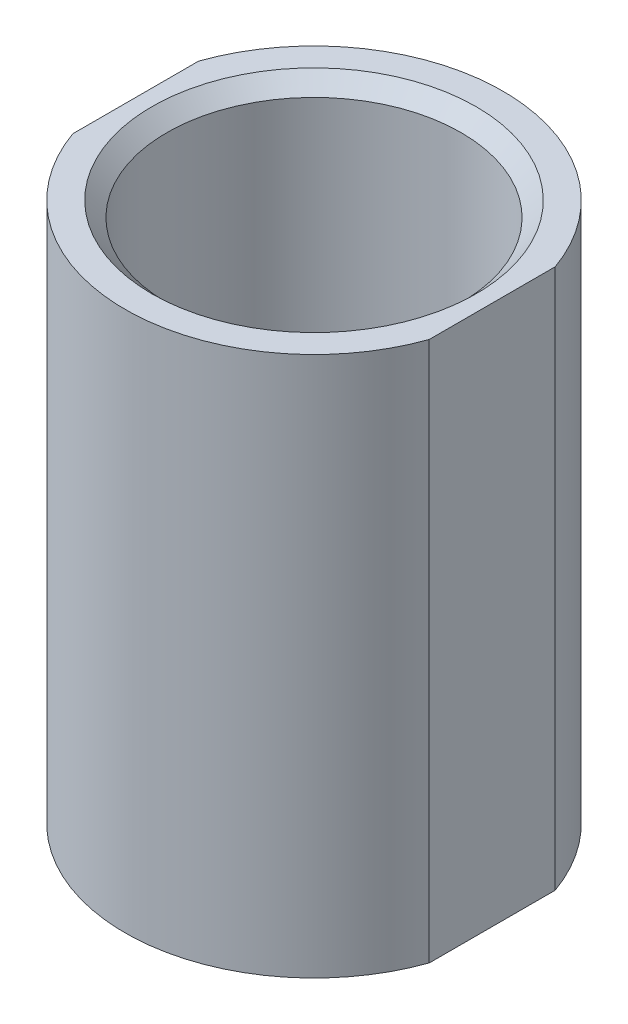
ISO-10303-21;
HEADER;
FILE_DESCRIPTION(('STEP AP214'),'2;1');
FILE_NAME('part.step','',(''),(''),'','','');
FILE_SCHEMA(('AUTOMOTIVE_DESIGN { 1 0 10303 214 1 1 1 1 }'));
ENDSEC;
DATA;
#1=APPLICATION_CONTEXT('core data for automotive mechanical design processes');
#2=APPLICATION_PROTOCOL_DEFINITION('international standard','automotive_design',2000,#1);
#3=PRODUCT_CONTEXT('',#1,'mechanical');
#4=PRODUCT('Part','Part','',(#3));
#5=PRODUCT_RELATED_PRODUCT_CATEGORY('part','',(#4));
#6=PRODUCT_DEFINITION_FORMATION('','',#4);
#7=PRODUCT_DEFINITION_CONTEXT('part definition',#1,'design');
#8=PRODUCT_DEFINITION('design','',#6,#7);
#9=PRODUCT_DEFINITION_SHAPE('','',#8);
#10=(LENGTH_UNIT() NAMED_UNIT(*) SI_UNIT(.MILLI.,.METRE.));
#11=(NAMED_UNIT(*) PLANE_ANGLE_UNIT() SI_UNIT($,.RADIAN.));
#12=(NAMED_UNIT(*) SI_UNIT($,.STERADIAN.) SOLID_ANGLE_UNIT());
#13=UNCERTAINTY_MEASURE_WITH_UNIT(LENGTH_MEASURE(1.E-05),#10,'distance_accuracy_value','');
#14=(GEOMETRIC_REPRESENTATION_CONTEXT(3) GLOBAL_UNCERTAINTY_ASSIGNED_CONTEXT((#13)) GLOBAL_UNIT_ASSIGNED_CONTEXT((#10,
#11,#12)) REPRESENTATION_CONTEXT('',''));
#15=CARTESIAN_POINT('',(0.,0.,0.));
#16=DIRECTION('',(0.,0.,1.));
#17=DIRECTION('',(1.,0.,0.));
#18=AXIS2_PLACEMENT_3D('',#15,#16,#17);
#19=CARTESIAN_POINT('',(33.,100.,0.));
#20=DIRECTION('',(1.,0.,0.));
#21=DIRECTION('',(0.,0.,-1.));
#22=AXIS2_PLACEMENT_3D('',#19,#20,#21);
#23=PLANE('',#22);
#24=DIRECTION('',(0.,0.,1.));
#25=VECTOR('',#24,1.);
#26=CARTESIAN_POINT('',(33.,0.,0.));
#27=LINE('',#26,#25);
#28=CARTESIAN_POINT('',(33.,0.,-11.6619037896906));
#29=VERTEX_POINT('',#28);
#30=CARTESIAN_POINT('',(33.,0.,11.6619037896906));
#31=VERTEX_POINT('',#30);
#32=EDGE_CURVE('E101',#29,#31,#27,.T.);
#33=ORIENTED_EDGE('',*,*,#32,.F.);
#34=DIRECTION('',(0.,-1.,0.));
#35=VECTOR('',#34,1.);
#36=CARTESIAN_POINT('',(33.,100.,-11.6619037896906));
#37=LINE('',#36,#35);
#38=CARTESIAN_POINT('',(33.,100.,-11.6619037896906));
#39=VERTEX_POINT('',#38);
#40=EDGE_CURVE('E11',#39,#29,#37,.T.);
#41=ORIENTED_EDGE('',*,*,#40,.F.);
#42=DIRECTION('',(0.,0.,1.));
#43=VECTOR('',#42,1.);
#44=CARTESIAN_POINT('',(33.,100.,0.));
#45=LINE('',#44,#43);
#46=CARTESIAN_POINT('',(33.,100.,11.6619037896906));
#47=VERTEX_POINT('',#46);
#48=EDGE_CURVE('E90',#39,#47,#45,.T.);
#49=ORIENTED_EDGE('',*,*,#48,.T.);
#50=DIRECTION('',(0.,-1.,0.));
#51=VECTOR('',#50,1.);
#52=CARTESIAN_POINT('',(33.,100.,11.6619037896906));
#53=LINE('',#52,#51);
#54=EDGE_CURVE('E79',#47,#31,#53,.T.);
#55=ORIENTED_EDGE('',*,*,#54,.T.);
#56=EDGE_LOOP('',(#33,#41,#49,#55));
#57=FACE_BOUND('',#56,.T.);
#58=ADVANCED_FACE('F40',(#57),#23,.T.);
#59=CARTESIAN_POINT('',(0.,100.,0.));
#60=DIRECTION('',(0.,-1.,0.));
#61=DIRECTION('',(0.,0.,-1.));
#62=AXIS2_PLACEMENT_3D('',#59,#60,#61);
#63=CYLINDRICAL_SURFACE('',#62,35.);
#64=CARTESIAN_POINT('',(0.,0.,0.));
#65=DIRECTION('',(0.,1.,0.));
#66=DIRECTION('',(0.,0.,1.));
#67=AXIS2_PLACEMENT_3D('',#64,#65,#66);
#68=CIRCLE('',#67,35.);
#69=CARTESIAN_POINT('',(-33.,0.,-11.6619037896906));
#70=VERTEX_POINT('',#69);
#71=EDGE_CURVE('E95',#29,#70,#68,.T.);
#72=ORIENTED_EDGE('',*,*,#71,.T.);
#73=DIRECTION('',(0.,-1.,0.));
#74=VECTOR('',#73,1.);
#75=CARTESIAN_POINT('',(-33.,100.,-11.6619037896906));
#76=LINE('',#75,#74);
#77=CARTESIAN_POINT('',(-33.,100.,-11.6619037896906));
#78=VERTEX_POINT('',#77);
#79=EDGE_CURVE('E48',#78,#70,#76,.T.);
#80=ORIENTED_EDGE('',*,*,#79,.F.);
#81=CARTESIAN_POINT('',(0.,100.,0.));
#82=DIRECTION('',(0.,1.,0.));
#83=DIRECTION('',(0.,0.,1.));
#84=AXIS2_PLACEMENT_3D('',#81,#82,#83);
#85=CIRCLE('',#84,35.);
#86=EDGE_CURVE('E85',#39,#78,#85,.T.);
#87=ORIENTED_EDGE('',*,*,#86,.F.);
#88=ORIENTED_EDGE('',*,*,#40,.T.);
#89=EDGE_LOOP('',(#72,#80,#87,#88));
#90=FACE_BOUND('',#89,.T.);
#91=ADVANCED_FACE('F93',(#90),#63,.T.);
#92=CARTESIAN_POINT('',(-33.,100.,0.));
#93=DIRECTION('',(1.,0.,0.));
#94=DIRECTION('',(0.,0.,-1.));
#95=AXIS2_PLACEMENT_3D('',#92,#93,#94);
#96=PLANE('',#95);
#97=DIRECTION('',(0.,0.,1.));
#98=VECTOR('',#97,1.);
#99=CARTESIAN_POINT('',(-33.,0.,0.));
#100=LINE('',#99,#98);
#101=CARTESIAN_POINT('',(-33.,0.,11.6619037896906));
#102=VERTEX_POINT('',#101);
#103=EDGE_CURVE('E72',#70,#102,#100,.T.);
#104=ORIENTED_EDGE('',*,*,#103,.T.);
#105=DIRECTION('',(0.,-1.,0.));
#106=VECTOR('',#105,1.);
#107=CARTESIAN_POINT('',(-33.,100.,11.6619037896906));
#108=LINE('',#107,#106);
#109=CARTESIAN_POINT('',(-33.,100.,11.6619037896906));
#110=VERTEX_POINT('',#109);
#111=EDGE_CURVE('E96',#110,#102,#108,.T.);
#112=ORIENTED_EDGE('',*,*,#111,.F.);
#113=DIRECTION('',(0.,0.,1.));
#114=VECTOR('',#113,1.);
#115=CARTESIAN_POINT('',(-33.,100.,0.));
#116=LINE('',#115,#114);
#117=EDGE_CURVE('E89',#78,#110,#116,.T.);
#118=ORIENTED_EDGE('',*,*,#117,.F.);
#119=ORIENTED_EDGE('',*,*,#79,.T.);
#120=EDGE_LOOP('',(#104,#112,#118,#119));
#121=FACE_BOUND('',#120,.T.);
#122=ADVANCED_FACE('F97',(#121),#96,.F.);
#123=EDGE_CURVE('E106',#102,#31,#68,.T.);
#124=ORIENTED_EDGE('',*,*,#123,.T.);
#125=ORIENTED_EDGE('',*,*,#54,.F.);
#126=EDGE_CURVE('E56',#110,#47,#85,.T.);
#127=ORIENTED_EDGE('',*,*,#126,.F.);
#128=ORIENTED_EDGE('',*,*,#111,.T.);
#129=EDGE_LOOP('',(#124,#125,#127,#128));
#130=FACE_BOUND('',#129,.T.);
#131=ADVANCED_FACE('F111',(#130),#63,.T.);
#132=CARTESIAN_POINT('',(0.,100.,0.));
#133=DIRECTION('',(0.,1.,0.));
#134=DIRECTION('',(0.,0.,1.));
#135=AXIS2_PLACEMENT_3D('',#132,#133,#134);
#136=PLANE('',#135);
#137=CARTESIAN_POINT('',(0.,100.,0.));
#138=DIRECTION('',(0.,1.,0.));
#139=DIRECTION('',(0.,0.,1.));
#140=AXIS2_PLACEMENT_3D('',#137,#138,#139);
#141=CIRCLE('',#140,30.025);
#142=CARTESIAN_POINT('',(0.,100.,30.025));
#143=VERTEX_POINT('',#142);
#144=EDGE_CURVE('E120',#143,#143,#141,.T.);
#145=ORIENTED_EDGE('',*,*,#144,.F.);
#146=EDGE_LOOP('',(#145));
#147=FACE_BOUND('',#146,.T.);
#148=ORIENTED_EDGE('',*,*,#48,.F.);
#149=ORIENTED_EDGE('',*,*,#86,.T.);
#150=ORIENTED_EDGE('',*,*,#117,.T.);
#151=ORIENTED_EDGE('',*,*,#126,.T.);
#152=EDGE_LOOP('',(#148,#149,#150,#151));
#153=FACE_BOUND('',#152,.T.);
#154=ADVANCED_FACE('F87',(#147,#153),#136,.T.);
#155=CARTESIAN_POINT('',(0.,0.,0.));
#156=DIRECTION('',(0.,1.,0.));
#157=DIRECTION('',(0.,0.,1.));
#158=AXIS2_PLACEMENT_3D('',#155,#156,#157);
#159=PLANE('',#158);
#160=CARTESIAN_POINT('',(0.,0.,0.));
#161=DIRECTION('',(0.,1.,0.));
#162=DIRECTION('',(0.,0.,1.));
#163=AXIS2_PLACEMENT_3D('',#160,#161,#162);
#164=CIRCLE('',#163,27.25);
#165=CARTESIAN_POINT('',(0.,0.,27.25));
#166=VERTEX_POINT('',#165);
#167=EDGE_CURVE('E104',#166,#166,#164,.T.);
#168=ORIENTED_EDGE('',*,*,#167,.T.);
#169=EDGE_LOOP('',(#168));
#170=FACE_BOUND('',#169,.T.);
#171=ORIENTED_EDGE('',*,*,#32,.T.);
#172=ORIENTED_EDGE('',*,*,#123,.F.);
#173=ORIENTED_EDGE('',*,*,#103,.F.);
#174=ORIENTED_EDGE('',*,*,#71,.F.);
#175=EDGE_LOOP('',(#171,#172,#173,#174));
#176=FACE_BOUND('',#175,.T.);
#177=ADVANCED_FACE('F113',(#170,#176),#159,.F.);
#178=CARTESIAN_POINT('',(0.,100.,0.));
#179=DIRECTION('',(0.,1.,0.));
#180=DIRECTION('',(0.,0.,1.));
#181=AXIS2_PLACEMENT_3D('',#178,#179,#180);
#182=CYLINDRICAL_SURFACE('',#181,27.25);
#183=ORIENTED_EDGE('',*,*,#167,.F.);
#184=EDGE_LOOP('',(#183));
#185=FACE_BOUND('',#184,.T.);
#186=CARTESIAN_POINT('',(0.,97.225,0.));
#187=DIRECTION('',(0.,1.,0.));
#188=DIRECTION('',(0.,0.,1.));
#189=AXIS2_PLACEMENT_3D('',#186,#187,#188);
#190=CIRCLE('',#189,27.25);
#191=CARTESIAN_POINT('',(0.,97.225,27.25));
#192=VERTEX_POINT('',#191);
#193=EDGE_CURVE('E117',#192,#192,#190,.T.);
#194=ORIENTED_EDGE('',*,*,#193,.T.);
#195=EDGE_LOOP('',(#194));
#196=FACE_BOUND('',#195,.T.);
#197=ADVANCED_FACE('F132',(#185,#196),#182,.F.);
#198=CARTESIAN_POINT('',(0.,100.,0.));
#199=DIRECTION('',(0.,1.,0.));
#200=DIRECTION('',(0.,0.,1.));
#201=AXIS2_PLACEMENT_3D('',#198,#199,#200);
#202=CONICAL_SURFACE('',#201,30.025,0.785398163397451);
#203=ORIENTED_EDGE('',*,*,#193,.F.);
#204=EDGE_LOOP('',(#203));
#205=FACE_BOUND('',#204,.T.);
#206=ORIENTED_EDGE('',*,*,#144,.T.);
#207=EDGE_LOOP('',(#206));
#208=FACE_BOUND('',#207,.T.);
#209=ADVANCED_FACE('F124',(#205,#208),#202,.F.);
#210=CLOSED_SHELL('',(#58,#91,#122,#131,#154,#177,#197,#209));
#211=MANIFOLD_SOLID_BREP('B2',#210);
#212=ADVANCED_BREP_SHAPE_REPRESENTATION('',(#18,#211),#14);
#213=SHAPE_DEFINITION_REPRESENTATION(#9,#212);
ENDSEC;
END-ISO-10303-21;
